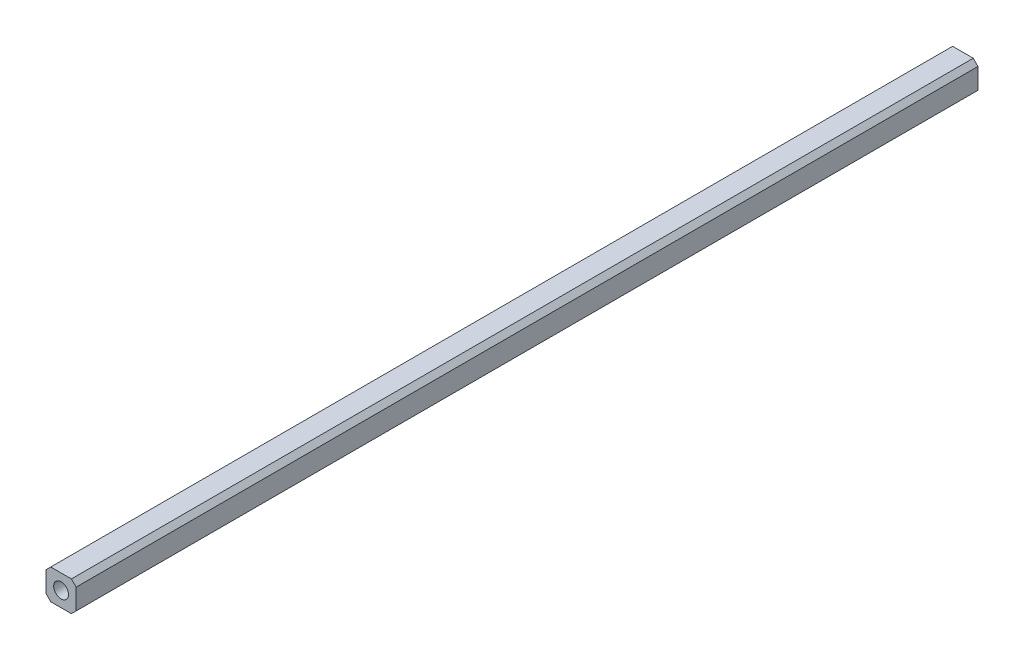
ISO-10303-21;
HEADER;
FILE_DESCRIPTION(('STEP AP214'),'2;1');
FILE_NAME('part.step','',(''),(''),'','','');
FILE_SCHEMA(('AUTOMOTIVE_DESIGN { 1 0 10303 214 1 1 1 1 }'));
ENDSEC;
DATA;
#1=APPLICATION_CONTEXT('core data for automotive mechanical design processes');
#2=APPLICATION_PROTOCOL_DEFINITION('international standard','automotive_design',2000,#1);
#3=PRODUCT_CONTEXT('',#1,'mechanical');
#4=PRODUCT('Part','Part','',(#3));
#5=PRODUCT_RELATED_PRODUCT_CATEGORY('part','',(#4));
#6=PRODUCT_DEFINITION_FORMATION('','',#4);
#7=PRODUCT_DEFINITION_CONTEXT('part definition',#1,'design');
#8=PRODUCT_DEFINITION('design','',#6,#7);
#9=PRODUCT_DEFINITION_SHAPE('','',#8);
#10=(LENGTH_UNIT() NAMED_UNIT(*) SI_UNIT(.MILLI.,.METRE.));
#11=(NAMED_UNIT(*) PLANE_ANGLE_UNIT() SI_UNIT($,.RADIAN.));
#12=(NAMED_UNIT(*) SI_UNIT($,.STERADIAN.) SOLID_ANGLE_UNIT());
#13=UNCERTAINTY_MEASURE_WITH_UNIT(LENGTH_MEASURE(1.E-05),#10,'distance_accuracy_value','');
#14=(GEOMETRIC_REPRESENTATION_CONTEXT(3) GLOBAL_UNCERTAINTY_ASSIGNED_CONTEXT((#13)) GLOBAL_UNIT_ASSIGNED_CONTEXT((#10,
#11,#12)) REPRESENTATION_CONTEXT('',''));
#15=CARTESIAN_POINT('',(0.,0.,0.));
#16=DIRECTION('',(0.,0.,1.));
#17=DIRECTION('',(1.,0.,0.));
#18=AXIS2_PLACEMENT_3D('',#15,#16,#17);
#19=CARTESIAN_POINT('',(-6.35,6.35,190.));
#20=DIRECTION('',(0.,1.,0.));
#21=DIRECTION('',(0.,0.,1.));
#22=AXIS2_PLACEMENT_3D('',#19,#20,#21);
#23=PLANE('',#22);
#24=DIRECTION('',(1.,0.,0.));
#25=VECTOR('',#24,1.);
#26=CARTESIAN_POINT('',(-6.35,6.35,-190.));
#27=LINE('',#26,#25);
#28=CARTESIAN_POINT('',(-4.34999999999994,6.35,-190.));
#29=VERTEX_POINT('',#28);
#30=CARTESIAN_POINT('',(4.34999999999994,6.35,-190.));
#31=VERTEX_POINT('',#30);
#32=EDGE_CURVE('E176',#29,#31,#27,.T.);
#33=ORIENTED_EDGE('',*,*,#32,.F.);
#34=DIRECTION('',(0.,0.,1.));
#35=VECTOR('',#34,1.);
#36=CARTESIAN_POINT('',(-4.34999999999994,6.35,190.));
#37=LINE('',#36,#35);
#38=CARTESIAN_POINT('',(-4.34999999999994,6.35,190.));
#39=VERTEX_POINT('',#38);
#40=EDGE_CURVE('E106',#29,#39,#37,.T.);
#41=ORIENTED_EDGE('',*,*,#40,.T.);
#42=DIRECTION('',(1.,0.,0.));
#43=VECTOR('',#42,1.);
#44=CARTESIAN_POINT('',(-6.35,6.35,190.));
#45=LINE('',#44,#43);
#46=CARTESIAN_POINT('',(4.34999999999994,6.35,190.));
#47=VERTEX_POINT('',#46);
#48=EDGE_CURVE('E127',#39,#47,#45,.T.);
#49=ORIENTED_EDGE('',*,*,#48,.T.);
#50=DIRECTION('',(0.,0.,-1.));
#51=VECTOR('',#50,1.);
#52=CARTESIAN_POINT('',(4.34999999999994,6.35,190.));
#53=LINE('',#52,#51);
#54=EDGE_CURVE('E111',#47,#31,#53,.T.);
#55=ORIENTED_EDGE('',*,*,#54,.T.);
#56=EDGE_LOOP('',(#33,#41,#49,#55));
#57=FACE_BOUND('',#56,.T.);
#58=ADVANCED_FACE('F34',(#57),#23,.T.);
#59=CARTESIAN_POINT('',(-6.35,6.35,190.));
#60=DIRECTION('',(1.,0.,0.));
#61=DIRECTION('',(0.,1.,0.));
#62=AXIS2_PLACEMENT_3D('',#59,#60,#61);
#63=PLANE('',#62);
#64=DIRECTION('',(0.,-1.,0.));
#65=VECTOR('',#64,1.);
#66=CARTESIAN_POINT('',(-6.35,6.35,190.));
#67=LINE('',#66,#65);
#68=CARTESIAN_POINT('',(-6.35,4.34999999999994,190.));
#69=VERTEX_POINT('',#68);
#70=CARTESIAN_POINT('',(-6.35,-4.34999999999994,190.));
#71=VERTEX_POINT('',#70);
#72=EDGE_CURVE('E121',#69,#71,#67,.T.);
#73=ORIENTED_EDGE('',*,*,#72,.F.);
#74=DIRECTION('',(0.,0.,-1.));
#75=VECTOR('',#74,1.);
#76=CARTESIAN_POINT('',(-6.35,4.34999999999994,-190.));
#77=LINE('',#76,#75);
#78=CARTESIAN_POINT('',(-6.35,4.34999999999994,-190.));
#79=VERTEX_POINT('',#78);
#80=EDGE_CURVE('E105',#69,#79,#77,.T.);
#81=ORIENTED_EDGE('',*,*,#80,.T.);
#82=DIRECTION('',(0.,-1.,0.));
#83=VECTOR('',#82,1.);
#84=CARTESIAN_POINT('',(-6.35,6.35,-190.));
#85=LINE('',#84,#83);
#86=CARTESIAN_POINT('',(-6.35,-4.34999999999994,-190.));
#87=VERTEX_POINT('',#86);
#88=EDGE_CURVE('E118',#79,#87,#85,.T.);
#89=ORIENTED_EDGE('',*,*,#88,.T.);
#90=DIRECTION('',(0.,0.,1.));
#91=VECTOR('',#90,1.);
#92=CARTESIAN_POINT('',(-6.35,-4.34999999999994,190.));
#93=LINE('',#92,#91);
#94=EDGE_CURVE('E123',#87,#71,#93,.T.);
#95=ORIENTED_EDGE('',*,*,#94,.T.);
#96=EDGE_LOOP('',(#73,#81,#89,#95));
#97=FACE_BOUND('',#96,.T.);
#98=ADVANCED_FACE('F117',(#97),#63,.F.);
#99=CARTESIAN_POINT('',(-6.35,-6.35,190.));
#100=DIRECTION('',(0.,1.,0.));
#101=DIRECTION('',(0.,0.,1.));
#102=AXIS2_PLACEMENT_3D('',#99,#100,#101);
#103=PLANE('',#102);
#104=DIRECTION('',(1.,0.,0.));
#105=VECTOR('',#104,1.);
#106=CARTESIAN_POINT('',(-6.35,-6.35,190.));
#107=LINE('',#106,#105);
#108=CARTESIAN_POINT('',(-4.34999999999994,-6.35,190.));
#109=VERTEX_POINT('',#108);
#110=CARTESIAN_POINT('',(4.34999999999994,-6.35,190.));
#111=VERTEX_POINT('',#110);
#112=EDGE_CURVE('E162',#109,#111,#107,.T.);
#113=ORIENTED_EDGE('',*,*,#112,.F.);
#114=DIRECTION('',(0.,0.,-1.));
#115=VECTOR('',#114,1.);
#116=CARTESIAN_POINT('',(-4.34999999999994,-6.35,190.));
#117=LINE('',#116,#115);
#118=CARTESIAN_POINT('',(-4.34999999999994,-6.35,-190.));
#119=VERTEX_POINT('',#118);
#120=EDGE_CURVE('E155',#109,#119,#117,.T.);
#121=ORIENTED_EDGE('',*,*,#120,.T.);
#122=DIRECTION('',(1.,0.,0.));
#123=VECTOR('',#122,1.);
#124=CARTESIAN_POINT('',(-6.35,-6.35,-190.));
#125=LINE('',#124,#123);
#126=CARTESIAN_POINT('',(4.34999999999994,-6.35,-190.));
#127=VERTEX_POINT('',#126);
#128=EDGE_CURVE('E128',#119,#127,#125,.T.);
#129=ORIENTED_EDGE('',*,*,#128,.T.);
#130=DIRECTION('',(0.,0.,1.));
#131=VECTOR('',#130,1.);
#132=CARTESIAN_POINT('',(4.34999999999994,-6.35,190.));
#133=LINE('',#132,#131);
#134=EDGE_CURVE('E153',#127,#111,#133,.T.);
#135=ORIENTED_EDGE('',*,*,#134,.T.);
#136=EDGE_LOOP('',(#113,#121,#129,#135));
#137=FACE_BOUND('',#136,.T.);
#138=ADVANCED_FACE('F160',(#137),#103,.F.);
#139=CARTESIAN_POINT('',(6.35,6.35,190.));
#140=DIRECTION('',(1.,0.,0.));
#141=DIRECTION('',(0.,1.,0.));
#142=AXIS2_PLACEMENT_3D('',#139,#140,#141);
#143=PLANE('',#142);
#144=DIRECTION('',(0.,-1.,0.));
#145=VECTOR('',#144,1.);
#146=CARTESIAN_POINT('',(6.35,6.35,190.));
#147=LINE('',#146,#145);
#148=CARTESIAN_POINT('',(6.35,4.34999999999994,190.));
#149=VERTEX_POINT('',#148);
#150=CARTESIAN_POINT('',(6.35,-4.34999999999994,190.));
#151=VERTEX_POINT('',#150);
#152=EDGE_CURVE('E131',#149,#151,#147,.T.);
#153=ORIENTED_EDGE('',*,*,#152,.T.);
#154=DIRECTION('',(0.,0.,-1.));
#155=VECTOR('',#154,1.);
#156=CARTESIAN_POINT('',(6.35,-4.34999999999994,-190.));
#157=LINE('',#156,#155);
#158=CARTESIAN_POINT('',(6.35,-4.34999999999994,-190.));
#159=VERTEX_POINT('',#158);
#160=EDGE_CURVE('E11',#151,#159,#157,.T.);
#161=ORIENTED_EDGE('',*,*,#160,.T.);
#162=DIRECTION('',(0.,-1.,0.));
#163=VECTOR('',#162,1.);
#164=CARTESIAN_POINT('',(6.35,6.35,-190.));
#165=LINE('',#164,#163);
#166=CARTESIAN_POINT('',(6.35,4.34999999999994,-190.));
#167=VERTEX_POINT('',#166);
#168=EDGE_CURVE('E134',#167,#159,#165,.T.);
#169=ORIENTED_EDGE('',*,*,#168,.F.);
#170=DIRECTION('',(0.,0.,1.));
#171=VECTOR('',#170,1.);
#172=CARTESIAN_POINT('',(6.35,4.34999999999994,190.));
#173=LINE('',#172,#171);
#174=EDGE_CURVE('E43',#167,#149,#173,.T.);
#175=ORIENTED_EDGE('',*,*,#174,.T.);
#176=EDGE_LOOP('',(#153,#161,#169,#175));
#177=FACE_BOUND('',#176,.T.);
#178=ADVANCED_FACE('F169',(#177),#143,.T.);
#179=CARTESIAN_POINT('',(0.,0.,190.));
#180=DIRECTION('',(0.,0.,-1.));
#181=DIRECTION('',(-1.,0.,0.));
#182=AXIS2_PLACEMENT_3D('',#179,#180,#181);
#183=PLANE('',#182);
#184=CARTESIAN_POINT('',(0.,0.,190.));
#185=DIRECTION('',(0.,0.,1.));
#186=DIRECTION('',(1.,0.,0.));
#187=AXIS2_PLACEMENT_3D('',#184,#185,#186);
#188=CIRCLE('',#187,3.125);
#189=CARTESIAN_POINT('',(3.125,0.,190.));
#190=VERTEX_POINT('',#189);
#191=EDGE_CURVE('E179',#190,#190,#188,.T.);
#192=ORIENTED_EDGE('',*,*,#191,.F.);
#193=EDGE_LOOP('',(#192));
#194=FACE_BOUND('',#193,.T.);
#195=ORIENTED_EDGE('',*,*,#48,.F.);
#196=DIRECTION('',(-0.707106781186548,-0.707106781186548,0.));
#197=VECTOR('',#196,1.);
#198=CARTESIAN_POINT('',(-6.35,4.34999999999994,190.));
#199=LINE('',#198,#197);
#200=EDGE_CURVE('E151',#39,#69,#199,.T.);
#201=ORIENTED_EDGE('',*,*,#200,.T.);
#202=ORIENTED_EDGE('',*,*,#72,.T.);
#203=DIRECTION('',(-0.707106781186548,0.707106781186548,0.));
#204=VECTOR('',#203,1.);
#205=CARTESIAN_POINT('',(-4.34999999999994,-6.35,190.));
#206=LINE('',#205,#204);
#207=EDGE_CURVE('E149',#71,#109,#206,.F.);
#208=ORIENTED_EDGE('',*,*,#207,.T.);
#209=ORIENTED_EDGE('',*,*,#112,.T.);
#210=DIRECTION('',(0.707106781186548,0.707106781186548,0.));
#211=VECTOR('',#210,1.);
#212=CARTESIAN_POINT('',(6.35,-4.34999999999994,190.));
#213=LINE('',#212,#211);
#214=EDGE_CURVE('E50',#111,#151,#213,.T.);
#215=ORIENTED_EDGE('',*,*,#214,.T.);
#216=ORIENTED_EDGE('',*,*,#152,.F.);
#217=DIRECTION('',(0.707106781186548,-0.707106781186548,0.));
#218=VECTOR('',#217,1.);
#219=CARTESIAN_POINT('',(4.34999999999994,6.35,190.));
#220=LINE('',#219,#218);
#221=EDGE_CURVE('E146',#149,#47,#220,.F.);
#222=ORIENTED_EDGE('',*,*,#221,.T.);
#223=EDGE_LOOP('',(#195,#201,#202,#208,#209,#215,#216,#222));
#224=FACE_BOUND('',#223,.T.);
#225=ADVANCED_FACE('F188',(#194,#224),#183,.F.);
#226=CARTESIAN_POINT('',(0.,0.,-190.));
#227=DIRECTION('',(0.,0.,-1.));
#228=DIRECTION('',(-1.,0.,0.));
#229=AXIS2_PLACEMENT_3D('',#226,#227,#228);
#230=PLANE('',#229);
#231=ORIENTED_EDGE('',*,*,#88,.F.);
#232=DIRECTION('',(0.707106781186548,0.707106781186548,0.));
#233=VECTOR('',#232,1.);
#234=CARTESIAN_POINT('',(-5.34999999999997,5.34999999999997,-190.));
#235=LINE('',#234,#233);
#236=EDGE_CURVE('E101',#79,#29,#235,.T.);
#237=ORIENTED_EDGE('',*,*,#236,.T.);
#238=ORIENTED_EDGE('',*,*,#32,.T.);
#239=DIRECTION('',(-0.707106781186548,0.707106781186548,0.));
#240=VECTOR('',#239,1.);
#241=CARTESIAN_POINT('',(5.34999999999997,5.34999999999997,-190.));
#242=LINE('',#241,#240);
#243=EDGE_CURVE('E122',#31,#167,#242,.F.);
#244=ORIENTED_EDGE('',*,*,#243,.T.);
#245=ORIENTED_EDGE('',*,*,#168,.T.);
#246=DIRECTION('',(-0.707106781186548,-0.707106781186548,0.));
#247=VECTOR('',#246,1.);
#248=CARTESIAN_POINT('',(5.34999999999997,-5.34999999999997,-190.));
#249=LINE('',#248,#247);
#250=EDGE_CURVE('E140',#159,#127,#249,.T.);
#251=ORIENTED_EDGE('',*,*,#250,.T.);
#252=ORIENTED_EDGE('',*,*,#128,.F.);
#253=DIRECTION('',(0.707106781186548,-0.707106781186548,0.));
#254=VECTOR('',#253,1.);
#255=CARTESIAN_POINT('',(-5.34999999999997,-5.34999999999997,-190.));
#256=LINE('',#255,#254);
#257=EDGE_CURVE('E112',#119,#87,#256,.F.);
#258=ORIENTED_EDGE('',*,*,#257,.T.);
#259=EDGE_LOOP('',(#231,#237,#238,#244,#245,#251,#252,#258));
#260=FACE_BOUND('',#259,.T.);
#261=ADVANCED_FACE('F125',(#260),#230,.T.);
#262=CARTESIAN_POINT('',(0.,0.,180.));
#263=DIRECTION('',(0.,0.,1.));
#264=DIRECTION('',(1.,0.,0.));
#265=AXIS2_PLACEMENT_3D('',#262,#263,#264);
#266=CYLINDRICAL_SURFACE('',#265,3.125);
#267=CARTESIAN_POINT('',(0.,0.,180.));
#268=DIRECTION('',(0.,0.,1.));
#269=DIRECTION('',(1.,0.,0.));
#270=AXIS2_PLACEMENT_3D('',#267,#268,#269);
#271=CIRCLE('',#270,3.125);
#272=CARTESIAN_POINT('',(3.125,0.,180.));
#273=VERTEX_POINT('',#272);
#274=EDGE_CURVE('E177',#273,#273,#271,.T.);
#275=ORIENTED_EDGE('',*,*,#274,.F.);
#276=EDGE_LOOP('',(#275));
#277=FACE_BOUND('',#276,.T.);
#278=ORIENTED_EDGE('',*,*,#191,.T.);
#279=EDGE_LOOP('',(#278));
#280=FACE_BOUND('',#279,.T.);
#281=ADVANCED_FACE('F186',(#277,#280),#266,.F.);
#282=CARTESIAN_POINT('',(0.,0.,180.));
#283=DIRECTION('',(0.,0.,1.));
#284=DIRECTION('',(1.,0.,0.));
#285=AXIS2_PLACEMENT_3D('',#282,#283,#284);
#286=PLANE('',#285);
#287=ORIENTED_EDGE('',*,*,#274,.T.);
#288=EDGE_LOOP('',(#287));
#289=FACE_BOUND('',#288,.T.);
#290=ADVANCED_FACE('F215',(#289),#286,.T.);
#291=CARTESIAN_POINT('',(-6.35,4.34999999999994,190.));
#292=DIRECTION('',(-0.707106781186548,0.707106781186548,0.));
#293=DIRECTION('',(0.,0.,1.));
#294=AXIS2_PLACEMENT_3D('',#291,#292,#293);
#295=PLANE('',#294);
#296=ORIENTED_EDGE('',*,*,#200,.F.);
#297=ORIENTED_EDGE('',*,*,#40,.F.);
#298=ORIENTED_EDGE('',*,*,#236,.F.);
#299=ORIENTED_EDGE('',*,*,#80,.F.);
#300=EDGE_LOOP('',(#296,#297,#298,#299));
#301=FACE_BOUND('',#300,.T.);
#302=ADVANCED_FACE('F104',(#301),#295,.T.);
#303=CARTESIAN_POINT('',(-4.34999999999994,-6.35,190.));
#304=DIRECTION('',(0.707106781186548,0.707106781186548,0.));
#305=DIRECTION('',(0.,0.,-1.));
#306=AXIS2_PLACEMENT_3D('',#303,#304,#305);
#307=PLANE('',#306);
#308=ORIENTED_EDGE('',*,*,#207,.F.);
#309=ORIENTED_EDGE('',*,*,#94,.F.);
#310=ORIENTED_EDGE('',*,*,#257,.F.);
#311=ORIENTED_EDGE('',*,*,#120,.F.);
#312=EDGE_LOOP('',(#308,#309,#310,#311));
#313=FACE_BOUND('',#312,.T.);
#314=ADVANCED_FACE('F199',(#313),#307,.F.);
#315=CARTESIAN_POINT('',(6.35,-4.34999999999994,190.));
#316=DIRECTION('',(0.707106781186548,-0.707106781186548,0.));
#317=DIRECTION('',(0.,0.,1.));
#318=AXIS2_PLACEMENT_3D('',#315,#316,#317);
#319=PLANE('',#318);
#320=ORIENTED_EDGE('',*,*,#214,.F.);
#321=ORIENTED_EDGE('',*,*,#134,.F.);
#322=ORIENTED_EDGE('',*,*,#250,.F.);
#323=ORIENTED_EDGE('',*,*,#160,.F.);
#324=EDGE_LOOP('',(#320,#321,#322,#323));
#325=FACE_BOUND('',#324,.T.);
#326=ADVANCED_FACE('F168',(#325),#319,.T.);
#327=CARTESIAN_POINT('',(4.34999999999994,6.35,190.));
#328=DIRECTION('',(-0.707106781186548,-0.707106781186548,0.));
#329=DIRECTION('',(0.,0.,-1.));
#330=AXIS2_PLACEMENT_3D('',#327,#328,#329);
#331=PLANE('',#330);
#332=ORIENTED_EDGE('',*,*,#221,.F.);
#333=ORIENTED_EDGE('',*,*,#174,.F.);
#334=ORIENTED_EDGE('',*,*,#243,.F.);
#335=ORIENTED_EDGE('',*,*,#54,.F.);
#336=EDGE_LOOP('',(#332,#333,#334,#335));
#337=FACE_BOUND('',#336,.T.);
#338=ADVANCED_FACE('F37',(#337),#331,.F.);
#339=CLOSED_SHELL('',(#58,#98,#138,#178,#225,#261,#281,#290,#302,#314,#326,#338));
#340=MANIFOLD_SOLID_BREP('B2',#339);
#341=ADVANCED_BREP_SHAPE_REPRESENTATION('',(#18,#340),#14);
#342=SHAPE_DEFINITION_REPRESENTATION(#9,#341);
ENDSEC;
END-ISO-10303-21;
